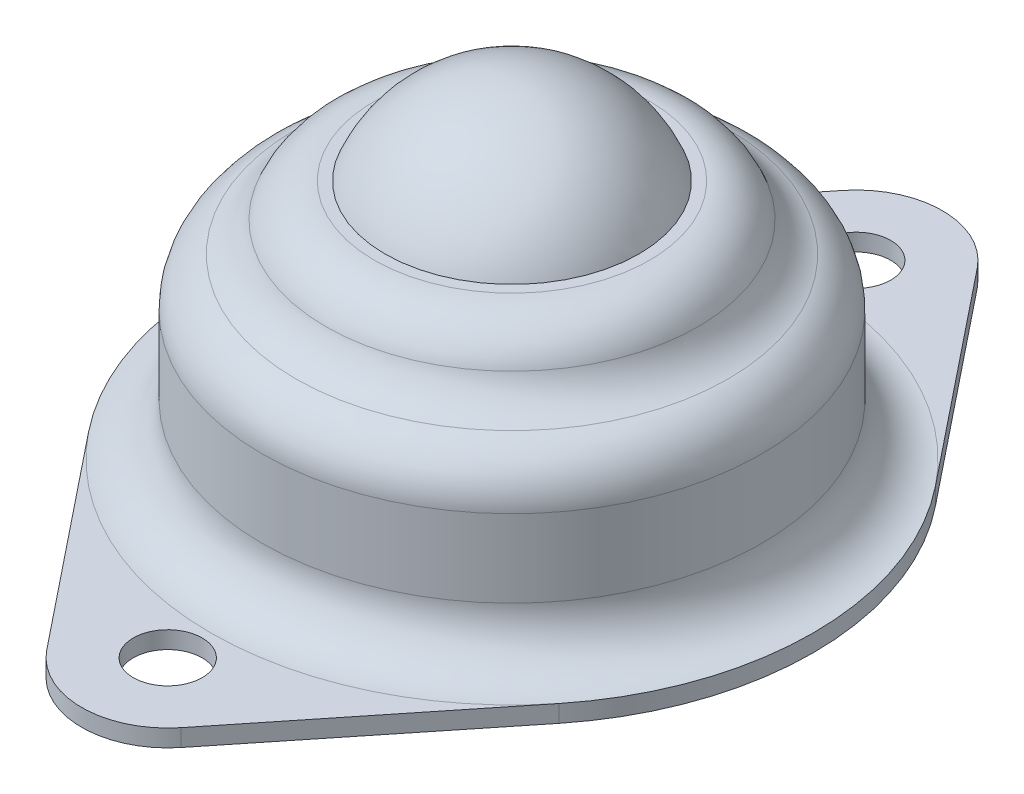
ISO-10303-21;
HEADER;
FILE_DESCRIPTION(('STEP AP214'),'2;1');
FILE_NAME('part.step','',(''),(''),'','','');
FILE_SCHEMA(('AUTOMOTIVE_DESIGN { 1 0 10303 214 1 1 1 1 }'));
ENDSEC;
DATA;
#1=APPLICATION_CONTEXT('core data for automotive mechanical design processes');
#2=APPLICATION_PROTOCOL_DEFINITION('international standard','automotive_design',2000,#1);
#3=PRODUCT_CONTEXT('',#1,'mechanical');
#4=PRODUCT('Part','Part','',(#3));
#5=PRODUCT_RELATED_PRODUCT_CATEGORY('part','',(#4));
#6=PRODUCT_DEFINITION_FORMATION('','',#4);
#7=PRODUCT_DEFINITION_CONTEXT('part definition',#1,'design');
#8=PRODUCT_DEFINITION('design','',#6,#7);
#9=PRODUCT_DEFINITION_SHAPE('','',#8);
#10=(LENGTH_UNIT() NAMED_UNIT(*) SI_UNIT(.MILLI.,.METRE.));
#11=(NAMED_UNIT(*) PLANE_ANGLE_UNIT() SI_UNIT($,.RADIAN.));
#12=(NAMED_UNIT(*) SI_UNIT($,.STERADIAN.) SOLID_ANGLE_UNIT());
#13=UNCERTAINTY_MEASURE_WITH_UNIT(LENGTH_MEASURE(1.E-05),#10,'distance_accuracy_value','');
#14=(GEOMETRIC_REPRESENTATION_CONTEXT(3) GLOBAL_UNCERTAINTY_ASSIGNED_CONTEXT((#13)) GLOBAL_UNIT_ASSIGNED_CONTEXT((#10,
#11,#12)) REPRESENTATION_CONTEXT('',''));
#15=CARTESIAN_POINT('',(0.,0.,0.));
#16=DIRECTION('',(0.,0.,1.));
#17=DIRECTION('',(1.,0.,0.));
#18=AXIS2_PLACEMENT_3D('',#15,#16,#17);
#19=CARTESIAN_POINT('',(0.,1.,0.));
#20=DIRECTION('',(0.,1.,0.));
#21=DIRECTION('',(0.,0.,1.));
#22=AXIS2_PLACEMENT_3D('',#19,#20,#21);
#23=PLANE('',#22);
#24=CARTESIAN_POINT('',(0.,1.,-20.));
#25=DIRECTION('',(0.,1.,0.));
#26=DIRECTION('',(0.,0.,1.));
#27=AXIS2_PLACEMENT_3D('',#24,#25,#26);
#28=CIRCLE('',#27,2.);
#29=CARTESIAN_POINT('',(0.,1.,-18.));
#30=VERTEX_POINT('',#29);
#31=EDGE_CURVE('E144',#30,#30,#28,.T.);
#32=ORIENTED_EDGE('',*,*,#31,.F.);
#33=EDGE_LOOP('',(#32));
#34=FACE_BOUND('',#33,.T.);
#35=DIRECTION('',(-0.625,0.,0.7806247497998));
#36=VECTOR('',#35,1.);
#37=CARTESIAN_POINT('',(-3.903123748999,1.,-23.125));
#38=LINE('',#37,#36);
#39=CARTESIAN_POINT('',(-3.903123748999,1.,-23.125));
#40=VERTEX_POINT('',#39);
#41=CARTESIAN_POINT('',(-13.6609331214965,1.,-10.9375));
#42=VERTEX_POINT('',#41);
#43=EDGE_CURVE('E245',#40,#42,#38,.T.);
#44=ORIENTED_EDGE('',*,*,#43,.T.);
#45=CARTESIAN_POINT('',(0.,1.,0.));
#46=DIRECTION('',(0.,1.,0.));
#47=DIRECTION('',(0.,0.,1.));
#48=AXIS2_PLACEMENT_3D('',#45,#46,#47);
#49=CIRCLE('',#48,17.5000000000001);
#50=CARTESIAN_POINT('',(13.6609331214965,1.,-10.9375));
#51=VERTEX_POINT('',#50);
#52=EDGE_CURVE('E11',#42,#51,#49,.F.);
#53=ORIENTED_EDGE('',*,*,#52,.T.);
#54=DIRECTION('',(-0.625,0.,-0.780624749799799));
#55=VECTOR('',#54,1.);
#56=CARTESIAN_POINT('',(3.903123748999,1.,-23.125));
#57=LINE('',#56,#55);
#58=CARTESIAN_POINT('',(3.903123748999,1.,-23.125));
#59=VERTEX_POINT('',#58);
#60=EDGE_CURVE('E238',#51,#59,#57,.T.);
#61=ORIENTED_EDGE('',*,*,#60,.T.);
#62=CARTESIAN_POINT('',(0.,1.,-20.));
#63=DIRECTION('',(0.,1.,0.));
#64=DIRECTION('',(0.,0.,1.));
#65=AXIS2_PLACEMENT_3D('',#62,#63,#64);
#66=CIRCLE('',#65,5.);
#67=EDGE_CURVE('E239',#59,#40,#66,.T.);
#68=ORIENTED_EDGE('',*,*,#67,.T.);
#69=EDGE_LOOP('',(#44,#53,#61,#68));
#70=FACE_BOUND('',#69,.T.);
#71=ADVANCED_FACE('F43',(#34,#70),#23,.T.);
#72=DIRECTION('',(0.624999999999989,0.,-0.780624749799808));
#73=VECTOR('',#72,1.);
#74=CARTESIAN_POINT('',(3.90312374899932,1.,23.1249999999999));
#75=LINE('',#74,#73);
#76=CARTESIAN_POINT('',(3.90312374899932,1.,23.1249999999999));
#77=VERTEX_POINT('',#76);
#78=CARTESIAN_POINT('',(13.6609331214967,1.,10.9374999999998));
#79=VERTEX_POINT('',#78);
#80=EDGE_CURVE('E58',#77,#79,#75,.T.);
#81=ORIENTED_EDGE('',*,*,#80,.T.);
#82=CARTESIAN_POINT('',(0.,1.,0.));
#83=DIRECTION('',(0.,1.,0.));
#84=DIRECTION('',(0.,0.,1.));
#85=AXIS2_PLACEMENT_3D('',#82,#83,#84);
#86=CIRCLE('',#85,17.5000000000001);
#87=CARTESIAN_POINT('',(-13.6609331214963,1.,10.9375000000002));
#88=VERTEX_POINT('',#87);
#89=EDGE_CURVE('E55',#79,#88,#86,.F.);
#90=ORIENTED_EDGE('',*,*,#89,.T.);
#91=DIRECTION('',(0.625000000000011,0.,0.780624749799791));
#92=VECTOR('',#91,1.);
#93=CARTESIAN_POINT('',(-3.90312374899868,1.,23.1250000000001));
#94=LINE('',#93,#92);
#95=CARTESIAN_POINT('',(-3.90312374899867,1.,23.1250000000001));
#96=VERTEX_POINT('',#95);
#97=EDGE_CURVE('E112',#88,#96,#94,.T.);
#98=ORIENTED_EDGE('',*,*,#97,.T.);
#99=CARTESIAN_POINT('',(2.79930830507024E-13,1.,20.));
#100=DIRECTION('',(0.,1.,0.));
#101=DIRECTION('',(0.,0.,-1.));
#102=AXIS2_PLACEMENT_3D('',#99,#100,#101);
#103=CIRCLE('',#102,5.);
#104=EDGE_CURVE('E118',#96,#77,#103,.T.);
#105=ORIENTED_EDGE('',*,*,#104,.T.);
#106=EDGE_LOOP('',(#81,#90,#98,#105));
#107=FACE_BOUND('',#106,.T.);
#108=CARTESIAN_POINT('',(2.79930830507024E-13,1.,20.));
#109=DIRECTION('',(0.,1.,0.));
#110=DIRECTION('',(0.,0.,-1.));
#111=AXIS2_PLACEMENT_3D('',#108,#109,#110);
#112=CIRCLE('',#111,2.);
#113=CARTESIAN_POINT('',(2.79930830507024E-13,1.,18.));
#114=VERTEX_POINT('',#113);
#115=EDGE_CURVE('E253',#114,#114,#112,.T.);
#116=ORIENTED_EDGE('',*,*,#115,.F.);
#117=EDGE_LOOP('',(#116));
#118=FACE_BOUND('',#117,.T.);
#119=ADVANCED_FACE('F116',(#107,#118),#23,.T.);
#120=CARTESIAN_POINT('',(0.,0.,0.));
#121=DIRECTION('',(0.,1.,0.));
#122=DIRECTION('',(0.,0.,1.));
#123=AXIS2_PLACEMENT_3D('',#120,#121,#122);
#124=PLANE('',#123);
#125=CARTESIAN_POINT('',(0.,0.,0.));
#126=DIRECTION('',(0.,1.,0.));
#127=DIRECTION('',(0.,0.,1.));
#128=AXIS2_PLACEMENT_3D('',#125,#126,#127);
#129=CIRCLE('',#128,17.5);
#130=CARTESIAN_POINT('',(13.6609331214967,0.,10.9374999999998));
#131=VERTEX_POINT('',#130);
#132=CARTESIAN_POINT('',(13.6609331214965,0.,-10.9375));
#133=VERTEX_POINT('',#132);
#134=EDGE_CURVE('E139',#131,#133,#129,.T.);
#135=ORIENTED_EDGE('',*,*,#134,.F.);
#136=DIRECTION('',(0.624999999999989,0.,-0.780624749799808));
#137=VECTOR('',#136,1.);
#138=CARTESIAN_POINT('',(3.90312374899932,0.,23.1249999999999));
#139=LINE('',#138,#137);
#140=CARTESIAN_POINT('',(3.90312374899932,0.,23.1249999999999));
#141=VERTEX_POINT('',#140);
#142=EDGE_CURVE('E94',#141,#131,#139,.T.);
#143=ORIENTED_EDGE('',*,*,#142,.F.);
#144=CARTESIAN_POINT('',(2.79930830507024E-13,0.,20.));
#145=DIRECTION('',(0.,1.,0.));
#146=DIRECTION('',(0.,0.,-1.));
#147=AXIS2_PLACEMENT_3D('',#144,#145,#146);
#148=CIRCLE('',#147,5.);
#149=CARTESIAN_POINT('',(-3.90312374899867,0.,23.1250000000001));
#150=VERTEX_POINT('',#149);
#151=EDGE_CURVE('E86',#150,#141,#148,.T.);
#152=ORIENTED_EDGE('',*,*,#151,.F.);
#153=DIRECTION('',(0.625000000000011,0.,0.780624749799791));
#154=VECTOR('',#153,1.);
#155=CARTESIAN_POINT('',(-3.90312374899868,0.,23.1250000000001));
#156=LINE('',#155,#154);
#157=CARTESIAN_POINT('',(-13.6609331214963,0.,10.9375000000002));
#158=VERTEX_POINT('',#157);
#159=EDGE_CURVE('E128',#158,#150,#156,.T.);
#160=ORIENTED_EDGE('',*,*,#159,.F.);
#161=CARTESIAN_POINT('',(0.,0.,0.));
#162=DIRECTION('',(0.,1.,0.));
#163=DIRECTION('',(0.,0.,1.));
#164=AXIS2_PLACEMENT_3D('',#161,#162,#163);
#165=CIRCLE('',#164,17.5);
#166=CARTESIAN_POINT('',(-13.6609331214965,0.,-10.9375));
#167=VERTEX_POINT('',#166);
#168=EDGE_CURVE('E148',#167,#158,#165,.T.);
#169=ORIENTED_EDGE('',*,*,#168,.F.);
#170=DIRECTION('',(-0.625,0.,0.7806247497998));
#171=VECTOR('',#170,1.);
#172=CARTESIAN_POINT('',(-3.903123748999,0.,-23.125));
#173=LINE('',#172,#171);
#174=CARTESIAN_POINT('',(-3.903123748999,0.,-23.125));
#175=VERTEX_POINT('',#174);
#176=EDGE_CURVE('E149',#175,#167,#173,.T.);
#177=ORIENTED_EDGE('',*,*,#176,.F.);
#178=CARTESIAN_POINT('',(0.,0.,-20.));
#179=DIRECTION('',(0.,1.,0.));
#180=DIRECTION('',(0.,0.,1.));
#181=AXIS2_PLACEMENT_3D('',#178,#179,#180);
#182=CIRCLE('',#181,5.);
#183=CARTESIAN_POINT('',(3.903123748999,0.,-23.125));
#184=VERTEX_POINT('',#183);
#185=EDGE_CURVE('E147',#184,#175,#182,.T.);
#186=ORIENTED_EDGE('',*,*,#185,.F.);
#187=DIRECTION('',(-0.625,0.,-0.780624749799799));
#188=VECTOR('',#187,1.);
#189=CARTESIAN_POINT('',(3.903123748999,0.,-23.125));
#190=LINE('',#189,#188);
#191=EDGE_CURVE('E141',#133,#184,#190,.T.);
#192=ORIENTED_EDGE('',*,*,#191,.F.);
#193=EDGE_LOOP('',(#135,#143,#152,#160,#169,#177,#186,#192));
#194=FACE_BOUND('',#193,.T.);
#195=CARTESIAN_POINT('',(0.,0.,-20.));
#196=DIRECTION('',(0.,1.,0.));
#197=DIRECTION('',(0.,0.,1.));
#198=AXIS2_PLACEMENT_3D('',#195,#196,#197);
#199=CIRCLE('',#198,2.);
#200=CARTESIAN_POINT('',(0.,0.,-18.));
#201=VERTEX_POINT('',#200);
#202=EDGE_CURVE('E255',#201,#201,#199,.T.);
#203=ORIENTED_EDGE('',*,*,#202,.T.);
#204=EDGE_LOOP('',(#203));
#205=FACE_BOUND('',#204,.T.);
#206=CARTESIAN_POINT('',(2.79930830507024E-13,0.,20.));
#207=DIRECTION('',(0.,1.,0.));
#208=DIRECTION('',(0.,0.,-1.));
#209=AXIS2_PLACEMENT_3D('',#206,#207,#208);
#210=CIRCLE('',#209,2.);
#211=CARTESIAN_POINT('',(2.79930830507024E-13,0.,18.));
#212=VERTEX_POINT('',#211);
#213=EDGE_CURVE('E259',#212,#212,#210,.T.);
#214=ORIENTED_EDGE('',*,*,#213,.T.);
#215=EDGE_LOOP('',(#214));
#216=FACE_BOUND('',#215,.T.);
#217=ADVANCED_FACE('F191',(#194,#205,#216),#124,.F.);
#218=CARTESIAN_POINT('',(0.,1.,0.));
#219=DIRECTION('',(0.,-1.,0.));
#220=DIRECTION('',(0.,0.,-1.));
#221=AXIS2_PLACEMENT_3D('',#218,#219,#220);
#222=CYLINDRICAL_SURFACE('',#221,17.5);
#223=ORIENTED_EDGE('',*,*,#134,.T.);
#224=DIRECTION('',(0.,-1.,0.));
#225=VECTOR('',#224,1.);
#226=CARTESIAN_POINT('',(13.6609331214965,1.,-10.9375));
#227=LINE('',#226,#225);
#228=EDGE_CURVE('E166',#51,#133,#227,.T.);
#229=ORIENTED_EDGE('',*,*,#228,.F.);
#230=CARTESIAN_POINT('',(0.,1.,0.));
#231=DIRECTION('',(0.,1.,0.));
#232=DIRECTION('',(0.,0.,1.));
#233=AXIS2_PLACEMENT_3D('',#230,#231,#232);
#234=CIRCLE('',#233,17.5);
#235=EDGE_CURVE('E153',#79,#51,#234,.T.);
#236=ORIENTED_EDGE('',*,*,#235,.F.);
#237=DIRECTION('',(0.,-1.,0.));
#238=VECTOR('',#237,1.);
#239=CARTESIAN_POINT('',(13.6609331214967,1.,10.9374999999998));
#240=LINE('',#239,#238);
#241=EDGE_CURVE('E136',#79,#131,#240,.T.);
#242=ORIENTED_EDGE('',*,*,#241,.T.);
#243=EDGE_LOOP('',(#223,#229,#236,#242));
#244=FACE_BOUND('',#243,.T.);
#245=ADVANCED_FACE('F205',(#244),#222,.T.);
#246=CARTESIAN_POINT('',(3.903123748999,1.,-23.125));
#247=DIRECTION('',(-0.780624749799799,0.,0.625));
#248=DIRECTION('',(0.625,0.,0.7806247497998));
#249=AXIS2_PLACEMENT_3D('',#246,#247,#248);
#250=PLANE('',#249);
#251=ORIENTED_EDGE('',*,*,#191,.T.);
#252=DIRECTION('',(0.,-1.,0.));
#253=VECTOR('',#252,1.);
#254=CARTESIAN_POINT('',(3.903123748999,1.,-23.125));
#255=LINE('',#254,#253);
#256=EDGE_CURVE('E164',#59,#184,#255,.T.);
#257=ORIENTED_EDGE('',*,*,#256,.F.);
#258=ORIENTED_EDGE('',*,*,#60,.F.);
#259=ORIENTED_EDGE('',*,*,#228,.T.);
#260=EDGE_LOOP('',(#251,#257,#258,#259));
#261=FACE_BOUND('',#260,.T.);
#262=ADVANCED_FACE('F225',(#261),#250,.F.);
#263=CARTESIAN_POINT('',(0.,1.,-20.));
#264=DIRECTION('',(0.,-1.,0.));
#265=DIRECTION('',(0.,0.,-1.));
#266=AXIS2_PLACEMENT_3D('',#263,#264,#265);
#267=CYLINDRICAL_SURFACE('',#266,5.);
#268=ORIENTED_EDGE('',*,*,#185,.T.);
#269=DIRECTION('',(0.,-1.,0.));
#270=VECTOR('',#269,1.);
#271=CARTESIAN_POINT('',(-3.903123748999,1.,-23.125));
#272=LINE('',#271,#270);
#273=EDGE_CURVE('E162',#40,#175,#272,.T.);
#274=ORIENTED_EDGE('',*,*,#273,.F.);
#275=ORIENTED_EDGE('',*,*,#67,.F.);
#276=ORIENTED_EDGE('',*,*,#256,.T.);
#277=EDGE_LOOP('',(#268,#274,#275,#276));
#278=FACE_BOUND('',#277,.T.);
#279=ADVANCED_FACE('F219',(#278),#267,.T.);
#280=CARTESIAN_POINT('',(-3.903123748999,1.,-23.125));
#281=DIRECTION('',(0.7806247497998,0.,0.625));
#282=DIRECTION('',(0.625,0.,-0.7806247497998));
#283=AXIS2_PLACEMENT_3D('',#280,#281,#282);
#284=PLANE('',#283);
#285=ORIENTED_EDGE('',*,*,#176,.T.);
#286=DIRECTION('',(0.,-1.,0.));
#287=VECTOR('',#286,1.);
#288=CARTESIAN_POINT('',(-13.6609331214965,1.,-10.9375));
#289=LINE('',#288,#287);
#290=EDGE_CURVE('E157',#42,#167,#289,.T.);
#291=ORIENTED_EDGE('',*,*,#290,.F.);
#292=ORIENTED_EDGE('',*,*,#43,.F.);
#293=ORIENTED_EDGE('',*,*,#273,.T.);
#294=EDGE_LOOP('',(#285,#291,#292,#293));
#295=FACE_BOUND('',#294,.T.);
#296=ADVANCED_FACE('F211',(#295),#284,.F.);
#297=CARTESIAN_POINT('',(0.,1.,0.));
#298=DIRECTION('',(0.,-1.,0.));
#299=DIRECTION('',(0.,0.,-1.));
#300=AXIS2_PLACEMENT_3D('',#297,#298,#299);
#301=CYLINDRICAL_SURFACE('',#300,17.5);
#302=ORIENTED_EDGE('',*,*,#168,.T.);
#303=DIRECTION('',(0.,-1.,0.));
#304=VECTOR('',#303,1.);
#305=CARTESIAN_POINT('',(-13.6609331214963,1.,10.9375000000002));
#306=LINE('',#305,#304);
#307=EDGE_CURVE('E132',#88,#158,#306,.T.);
#308=ORIENTED_EDGE('',*,*,#307,.F.);
#309=CARTESIAN_POINT('',(0.,1.,0.));
#310=DIRECTION('',(0.,1.,0.));
#311=DIRECTION('',(0.,0.,1.));
#312=AXIS2_PLACEMENT_3D('',#309,#310,#311);
#313=CIRCLE('',#312,17.5);
#314=EDGE_CURVE('E123',#42,#88,#313,.T.);
#315=ORIENTED_EDGE('',*,*,#314,.F.);
#316=ORIENTED_EDGE('',*,*,#290,.T.);
#317=EDGE_LOOP('',(#302,#308,#315,#316));
#318=FACE_BOUND('',#317,.T.);
#319=ADVANCED_FACE('F212',(#318),#301,.T.);
#320=CARTESIAN_POINT('',(-3.90312374899868,1.,23.1250000000001));
#321=DIRECTION('',(0.780624749799791,0.,-0.625000000000011));
#322=DIRECTION('',(-0.625000000000011,0.,-0.780624749799791));
#323=AXIS2_PLACEMENT_3D('',#320,#321,#322);
#324=PLANE('',#323);
#325=ORIENTED_EDGE('',*,*,#159,.T.);
#326=DIRECTION('',(0.,-1.,0.));
#327=VECTOR('',#326,1.);
#328=CARTESIAN_POINT('',(-3.90312374899867,1.,23.1250000000001));
#329=LINE('',#328,#327);
#330=EDGE_CURVE('E130',#96,#150,#329,.T.);
#331=ORIENTED_EDGE('',*,*,#330,.F.);
#332=ORIENTED_EDGE('',*,*,#97,.F.);
#333=ORIENTED_EDGE('',*,*,#307,.T.);
#334=EDGE_LOOP('',(#325,#331,#332,#333));
#335=FACE_BOUND('',#334,.T.);
#336=ADVANCED_FACE('F129',(#335),#324,.F.);
#337=CARTESIAN_POINT('',(2.79930830507024E-13,1.,20.));
#338=DIRECTION('',(0.,-1.,0.));
#339=DIRECTION('',(0.,0.,-1.));
#340=AXIS2_PLACEMENT_3D('',#337,#338,#339);
#341=CYLINDRICAL_SURFACE('',#340,5.);
#342=ORIENTED_EDGE('',*,*,#151,.T.);
#343=DIRECTION('',(0.,-1.,0.));
#344=VECTOR('',#343,1.);
#345=CARTESIAN_POINT('',(3.90312374899932,1.,23.1249999999999));
#346=LINE('',#345,#344);
#347=EDGE_CURVE('E135',#77,#141,#346,.T.);
#348=ORIENTED_EDGE('',*,*,#347,.F.);
#349=ORIENTED_EDGE('',*,*,#104,.F.);
#350=ORIENTED_EDGE('',*,*,#330,.T.);
#351=EDGE_LOOP('',(#342,#348,#349,#350));
#352=FACE_BOUND('',#351,.T.);
#353=ADVANCED_FACE('F131',(#352),#341,.T.);
#354=CARTESIAN_POINT('',(3.90312374899932,1.,23.1249999999999));
#355=DIRECTION('',(-0.780624749799808,0.,-0.624999999999989));
#356=DIRECTION('',(-0.62499999999999,0.,0.780624749799808));
#357=AXIS2_PLACEMENT_3D('',#354,#355,#356);
#358=PLANE('',#357);
#359=ORIENTED_EDGE('',*,*,#142,.T.);
#360=ORIENTED_EDGE('',*,*,#241,.F.);
#361=ORIENTED_EDGE('',*,*,#80,.F.);
#362=ORIENTED_EDGE('',*,*,#347,.T.);
#363=EDGE_LOOP('',(#359,#360,#361,#362));
#364=FACE_BOUND('',#363,.T.);
#365=ADVANCED_FACE('F202',(#364),#358,.F.);
#366=CARTESIAN_POINT('',(0.,1.,-20.));
#367=DIRECTION('',(0.,-1.,0.));
#368=DIRECTION('',(0.,0.,-1.));
#369=AXIS2_PLACEMENT_3D('',#366,#367,#368);
#370=CYLINDRICAL_SURFACE('',#369,2.);
#371=ORIENTED_EDGE('',*,*,#31,.T.);
#372=EDGE_LOOP('',(#371));
#373=FACE_BOUND('',#372,.T.);
#374=ORIENTED_EDGE('',*,*,#202,.F.);
#375=EDGE_LOOP('',(#374));
#376=FACE_BOUND('',#375,.T.);
#377=ADVANCED_FACE('F199',(#373,#376),#370,.F.);
#378=CARTESIAN_POINT('',(2.79930830507024E-13,1.,20.));
#379=DIRECTION('',(0.,-1.,0.));
#380=DIRECTION('',(0.,0.,-1.));
#381=AXIS2_PLACEMENT_3D('',#378,#379,#380);
#382=CYLINDRICAL_SURFACE('',#381,2.);
#383=ORIENTED_EDGE('',*,*,#115,.T.);
#384=EDGE_LOOP('',(#383));
#385=FACE_BOUND('',#384,.T.);
#386=ORIENTED_EDGE('',*,*,#213,.F.);
#387=EDGE_LOOP('',(#386));
#388=FACE_BOUND('',#387,.T.);
#389=ADVANCED_FACE('F281',(#385,#388),#382,.F.);
#390=CARTESIAN_POINT('',(0.,12.0000000000001,0.));
#391=DIRECTION('',(0.,1.,0.));
#392=DIRECTION('',(0.,0.,1.));
#393=AXIS2_PLACEMENT_3D('',#390,#391,#392);
#394=TOROIDAL_SURFACE('',#393,8.00000000000002,3.);
#395=CARTESIAN_POINT('',(0.,15.0000000000001,0.));
#396=DIRECTION('',(0.,1.,0.));
#397=DIRECTION('',(0.,0.,1.));
#398=AXIS2_PLACEMENT_3D('',#395,#396,#397);
#399=CIRCLE('',#398,8.);
#400=CARTESIAN_POINT('',(0.,15.,8.));
#401=VERTEX_POINT('',#400);
#402=EDGE_CURVE('E273',#401,#401,#399,.T.);
#403=ORIENTED_EDGE('',*,*,#402,.F.);
#404=EDGE_LOOP('',(#403));
#405=FACE_BOUND('',#404,.T.);
#406=CARTESIAN_POINT('',(0.,13.0574531042176,0.));
#407=DIRECTION('',(0.,1.,0.));
#408=DIRECTION('',(0.,0.,1.));
#409=AXIS2_PLACEMENT_3D('',#406,#407,#408);
#410=CIRCLE('',#409,10.8074531042175);
#411=CARTESIAN_POINT('',(0.,13.0574531042176,10.8074531042175));
#412=VERTEX_POINT('',#411);
#413=EDGE_CURVE('E262',#412,#412,#410,.T.);
#414=ORIENTED_EDGE('',*,*,#413,.T.);
#415=EDGE_LOOP('',(#414));
#416=FACE_BOUND('',#415,.T.);
#417=ADVANCED_FACE('F278',(#405,#416),#394,.T.);
#418=CARTESIAN_POINT('',(0.,14.1149062084352,0.));
#419=DIRECTION('',(0.,1.,0.));
#420=DIRECTION('',(0.,0.,1.));
#421=AXIS2_PLACEMENT_3D('',#418,#419,#420);
#422=TOROIDAL_SURFACE('',#421,13.6149062084351,3.);
#423=ORIENTED_EDGE('',*,*,#413,.F.);
#424=EDGE_LOOP('',(#423));
#425=FACE_BOUND('',#424,.T.);
#426=CARTESIAN_POINT('',(0.,11.3074531042176,0.));
#427=DIRECTION('',(0.,1.,0.));
#428=DIRECTION('',(0.,0.,1.));
#429=AXIS2_PLACEMENT_3D('',#426,#427,#428);
#430=CIRCLE('',#429,12.5574531042176);
#431=CARTESIAN_POINT('',(0.,11.3074531042176,12.5574531042175));
#432=VERTEX_POINT('',#431);
#433=EDGE_CURVE('E266',#432,#432,#430,.T.);
#434=ORIENTED_EDGE('',*,*,#433,.T.);
#435=EDGE_LOOP('',(#434));
#436=FACE_BOUND('',#435,.T.);
#437=ADVANCED_FACE('F284',(#425,#436),#422,.F.);
#438=CARTESIAN_POINT('',(0.,8.5000000000001,0.));
#439=DIRECTION('',(0.,1.,0.));
#440=DIRECTION('',(0.,0.,1.));
#441=AXIS2_PLACEMENT_3D('',#438,#439,#440);
#442=TOROIDAL_SURFACE('',#441,11.5,3.);
#443=ORIENTED_EDGE('',*,*,#433,.F.);
#444=EDGE_LOOP('',(#443));
#445=FACE_BOUND('',#444,.T.);
#446=CARTESIAN_POINT('',(0.,8.50000000000012,0.));
#447=DIRECTION('',(0.,1.,0.));
#448=DIRECTION('',(0.,0.,1.));
#449=AXIS2_PLACEMENT_3D('',#446,#447,#448);
#450=CIRCLE('',#449,14.5);
#451=CARTESIAN_POINT('',(0.,8.50000000000002,14.5));
#452=VERTEX_POINT('',#451);
#453=EDGE_CURVE('E267',#452,#452,#450,.T.);
#454=ORIENTED_EDGE('',*,*,#453,.T.);
#455=EDGE_LOOP('',(#454));
#456=FACE_BOUND('',#455,.T.);
#457=ADVANCED_FACE('F289',(#445,#456),#442,.T.);
#458=CARTESIAN_POINT('',(0.,15.,0.));
#459=DIRECTION('',(0.,1.,0.));
#460=DIRECTION('',(0.,0.,1.));
#461=AXIS2_PLACEMENT_3D('',#458,#459,#460);
#462=CYLINDRICAL_SURFACE('',#461,14.5000000000001);
#463=CARTESIAN_POINT('',(0.,4.00000000000002,0.));
#464=DIRECTION('',(0.,1.,0.));
#465=DIRECTION('',(0.,0.,1.));
#466=AXIS2_PLACEMENT_3D('',#463,#464,#465);
#467=CIRCLE('',#466,14.5000000000001);
#468=CARTESIAN_POINT('',(0.,4.00000000000002,14.5));
#469=VERTEX_POINT('',#468);
#470=EDGE_CURVE('E171',#469,#469,#467,.T.);
#471=ORIENTED_EDGE('',*,*,#470,.T.);
#472=EDGE_LOOP('',(#471));
#473=FACE_BOUND('',#472,.T.);
#474=ORIENTED_EDGE('',*,*,#453,.F.);
#475=EDGE_LOOP('',(#474));
#476=FACE_BOUND('',#475,.T.);
#477=ADVANCED_FACE('F174',(#473,#476),#462,.T.);
#478=CARTESIAN_POINT('',(0.,12.06,0.));
#479=DIRECTION('',(0.,1.,0.));
#480=DIRECTION('',(0.,0.,-1.));
#481=AXIS2_PLACEMENT_3D('',#478,#479,#480);
#482=SPHERICAL_SURFACE('',#481,7.94);
#483=CARTESIAN_POINT('',(0.,15.0000000000001,0.));
#484=DIRECTION('',(0.,1.,0.));
#485=DIRECTION('',(0.,0.,1.));
#486=AXIS2_PLACEMENT_3D('',#483,#484,#485);
#487=CIRCLE('',#486,7.37563556583431);
#488=CARTESIAN_POINT('',(0.,15.,7.37563556583431));
#489=VERTEX_POINT('',#488);
#490=EDGE_CURVE('E275',#489,#489,#487,.T.);
#491=ORIENTED_EDGE('',*,*,#490,.T.);
#492=EDGE_LOOP('',(#491));
#493=FACE_BOUND('',#492,.T.);
#494=ADVANCED_FACE('F184',(#493),#482,.T.);
#495=CARTESIAN_POINT('',(0.,15.0000000000001,0.));
#496=DIRECTION('',(0.,-1.,0.));
#497=DIRECTION('',(0.,0.,-1.));
#498=AXIS2_PLACEMENT_3D('',#495,#496,#497);
#499=PLANE('',#498);
#500=ORIENTED_EDGE('',*,*,#490,.F.);
#501=EDGE_LOOP('',(#500));
#502=FACE_BOUND('',#501,.T.);
#503=ORIENTED_EDGE('',*,*,#402,.T.);
#504=EDGE_LOOP('',(#503));
#505=FACE_BOUND('',#504,.T.);
#506=ADVANCED_FACE('F177',(#502,#505),#499,.F.);
#507=CARTESIAN_POINT('',(0.,4.,0.));
#508=DIRECTION('',(0.,1.,0.));
#509=DIRECTION('',(0.,0.,1.));
#510=AXIS2_PLACEMENT_3D('',#507,#508,#509);
#511=TOROIDAL_SURFACE('',#510,17.5000000000001,3.);
#512=ORIENTED_EDGE('',*,*,#52,.F.);
#513=ORIENTED_EDGE('',*,*,#314,.T.);
#514=ORIENTED_EDGE('',*,*,#89,.F.);
#515=ORIENTED_EDGE('',*,*,#235,.T.);
#516=EDGE_LOOP('',(#512,#513,#514,#515));
#517=FACE_BOUND('',#516,.T.);
#518=ORIENTED_EDGE('',*,*,#470,.F.);
#519=EDGE_LOOP('',(#518));
#520=FACE_BOUND('',#519,.T.);
#521=ADVANCED_FACE('F44',(#517,#520),#511,.F.);
#522=CLOSED_SHELL('',(#71,#119,#217,#245,#262,#279,#296,#319,#336,#353,#365,#377,#389,#417,#437,
#457,#477,#494,#506,#521));
#523=MANIFOLD_SOLID_BREP('B2',#522);
#524=ADVANCED_BREP_SHAPE_REPRESENTATION('',(#18,#523),#14);
#525=SHAPE_DEFINITION_REPRESENTATION(#9,#524);
ENDSEC;
END-ISO-10303-21;
